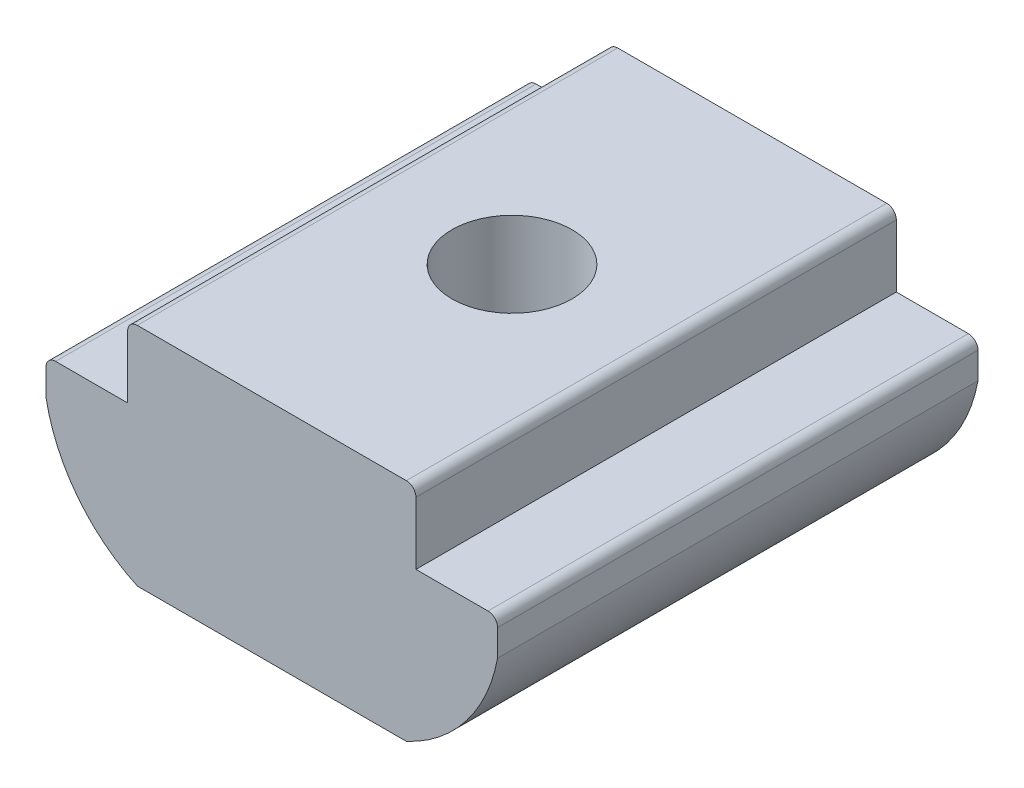
ISO-10303-21;
HEADER;
FILE_DESCRIPTION(('STEP AP214'),'2;1');
FILE_NAME('part.step','',(''),(''),'','','');
FILE_SCHEMA(('AUTOMOTIVE_DESIGN { 1 0 10303 214 1 1 1 1 }'));
ENDSEC;
DATA;
#1=APPLICATION_CONTEXT('core data for automotive mechanical design processes');
#2=APPLICATION_PROTOCOL_DEFINITION('international standard','automotive_design',2000,#1);
#3=PRODUCT_CONTEXT('',#1,'mechanical');
#4=PRODUCT('Part','Part','',(#3));
#5=PRODUCT_RELATED_PRODUCT_CATEGORY('part','',(#4));
#6=PRODUCT_DEFINITION_FORMATION('','',#4);
#7=PRODUCT_DEFINITION_CONTEXT('part definition',#1,'design');
#8=PRODUCT_DEFINITION('design','',#6,#7);
#9=PRODUCT_DEFINITION_SHAPE('','',#8);
#10=(LENGTH_UNIT() NAMED_UNIT(*) SI_UNIT(.MILLI.,.METRE.));
#11=(NAMED_UNIT(*) PLANE_ANGLE_UNIT() SI_UNIT($,.RADIAN.));
#12=(NAMED_UNIT(*) SI_UNIT($,.STERADIAN.) SOLID_ANGLE_UNIT());
#13=UNCERTAINTY_MEASURE_WITH_UNIT(LENGTH_MEASURE(1.E-05),#10,'distance_accuracy_value','');
#14=(GEOMETRIC_REPRESENTATION_CONTEXT(3) GLOBAL_UNCERTAINTY_ASSIGNED_CONTEXT((#13)) GLOBAL_UNIT_ASSIGNED_CONTEXT((#10,
#11,#12)) REPRESENTATION_CONTEXT('',''));
#15=CARTESIAN_POINT('',(0.,0.,0.));
#16=DIRECTION('',(0.,0.,1.));
#17=DIRECTION('',(1.,0.,0.));
#18=AXIS2_PLACEMENT_3D('',#15,#16,#17);
#19=CARTESIAN_POINT('',(-2.80000000000018,4.69999999999982,5.));
#20=DIRECTION('',(0.,-1.,0.));
#21=DIRECTION('',(0.,0.,-1.));
#22=AXIS2_PLACEMENT_3D('',#19,#20,#21);
#23=PLANE('',#22);
#24=DIRECTION('',(-1.,0.,0.));
#25=VECTOR('',#24,1.);
#26=CARTESIAN_POINT('',(-2.80000000000018,4.69999999999982,-5.));
#27=LINE('',#26,#25);
#28=CARTESIAN_POINT('',(2.80000000000018,4.69999999999982,-5.));
#29=VERTEX_POINT('',#28);
#30=CARTESIAN_POINT('',(-2.80000000000018,4.69999999999982,-5.));
#31=VERTEX_POINT('',#30);
#32=EDGE_CURVE('E112',#29,#31,#27,.T.);
#33=ORIENTED_EDGE('',*,*,#32,.T.);
#34=DIRECTION('',(0.,0.,-1.));
#35=VECTOR('',#34,1.);
#36=CARTESIAN_POINT('',(-2.80000000000018,4.69999999999982,5.));
#37=LINE('',#36,#35);
#38=CARTESIAN_POINT('',(-2.80000000000018,4.69999999999982,5.));
#39=VERTEX_POINT('',#38);
#40=EDGE_CURVE('E175',#39,#31,#37,.T.);
#41=ORIENTED_EDGE('',*,*,#40,.F.);
#42=DIRECTION('',(-1.,0.,0.));
#43=VECTOR('',#42,1.);
#44=CARTESIAN_POINT('',(-2.80000000000018,4.69999999999982,5.));
#45=LINE('',#44,#43);
#46=CARTESIAN_POINT('',(2.80000000000018,4.69999999999982,5.));
#47=VERTEX_POINT('',#46);
#48=EDGE_CURVE('E59',#47,#39,#45,.T.);
#49=ORIENTED_EDGE('',*,*,#48,.F.);
#50=DIRECTION('',(0.,0.,-1.));
#51=VECTOR('',#50,1.);
#52=CARTESIAN_POINT('',(2.80000000000018,4.69999999999982,5.));
#53=LINE('',#52,#51);
#54=EDGE_CURVE('E169',#47,#29,#53,.T.);
#55=ORIENTED_EDGE('',*,*,#54,.T.);
#56=EDGE_LOOP('',(#33,#41,#49,#55));
#57=FACE_BOUND('',#56,.T.);
#58=CARTESIAN_POINT('',(0.,4.69999999999982,0.));
#59=DIRECTION('',(0.,1.,0.));
#60=DIRECTION('',(0.,0.,1.));
#61=AXIS2_PLACEMENT_3D('',#58,#59,#60);
#62=CIRCLE('',#61,1.25);
#63=CARTESIAN_POINT('',(0.,4.69999999999982,1.25));
#64=VERTEX_POINT('',#63);
#65=EDGE_CURVE('E322',#64,#64,#62,.T.);
#66=ORIENTED_EDGE('',*,*,#65,.F.);
#67=EDGE_LOOP('',(#66));
#68=FACE_BOUND('',#67,.T.);
#69=ADVANCED_FACE('F41',(#57,#68),#23,.F.);
#70=CARTESIAN_POINT('',(-2.79999999999882,4.49999999999909,5.));
#71=DIRECTION('',(0.,0.,-1.));
#72=DIRECTION('',(-1.,0.,0.));
#73=AXIS2_PLACEMENT_3D('',#70,#71,#72);
#74=CYLINDRICAL_SURFACE('',#73,0.200000000000955);
#75=CARTESIAN_POINT('',(-2.79999999999882,4.49999999999909,-5.));
#76=DIRECTION('',(0.,0.,1.));
#77=DIRECTION('',(1.,0.,0.));
#78=AXIS2_PLACEMENT_3D('',#75,#76,#77);
#79=CIRCLE('',#78,0.200000000000955);
#80=CARTESIAN_POINT('',(-3.,4.5,-5.));
#81=VERTEX_POINT('',#80);
#82=EDGE_CURVE('E179',#31,#81,#79,.T.);
#83=ORIENTED_EDGE('',*,*,#82,.T.);
#84=DIRECTION('',(0.,0.,-1.));
#85=VECTOR('',#84,1.);
#86=CARTESIAN_POINT('',(-3.,4.5,5.));
#87=LINE('',#86,#85);
#88=CARTESIAN_POINT('',(-3.,4.5,5.));
#89=VERTEX_POINT('',#88);
#90=EDGE_CURVE('E11',#89,#81,#87,.T.);
#91=ORIENTED_EDGE('',*,*,#90,.F.);
#92=CARTESIAN_POINT('',(-2.79999999999882,4.49999999999909,5.));
#93=DIRECTION('',(0.,0.,1.));
#94=DIRECTION('',(1.,0.,0.));
#95=AXIS2_PLACEMENT_3D('',#92,#93,#94);
#96=CIRCLE('',#95,0.200000000000955);
#97=EDGE_CURVE('E220',#39,#89,#96,.T.);
#98=ORIENTED_EDGE('',*,*,#97,.F.);
#99=ORIENTED_EDGE('',*,*,#40,.T.);
#100=EDGE_LOOP('',(#83,#91,#98,#99));
#101=FACE_BOUND('',#100,.T.);
#102=ADVANCED_FACE('F43',(#101),#74,.T.);
#103=CARTESIAN_POINT('',(-3.,4.5,5.));
#104=DIRECTION('',(1.,-3.49947101211426E-13,0.));
#105=DIRECTION('',(3.49947101211426E-13,1.,0.));
#106=AXIS2_PLACEMENT_3D('',#103,#104,#105);
#107=PLANE('',#106);
#108=DIRECTION('',(-3.49947101211426E-13,-1.,0.));
#109=VECTOR('',#108,1.);
#110=CARTESIAN_POINT('',(-3.,4.5,-5.));
#111=LINE('',#110,#109);
#112=CARTESIAN_POINT('',(-3.00000000000046,3.19999999999982,-5.));
#113=VERTEX_POINT('',#112);
#114=EDGE_CURVE('E183',#81,#113,#111,.T.);
#115=ORIENTED_EDGE('',*,*,#114,.T.);
#116=DIRECTION('',(0.,0.,-1.));
#117=VECTOR('',#116,1.);
#118=CARTESIAN_POINT('',(-3.00000000000046,3.19999999999982,5.));
#119=LINE('',#118,#117);
#120=CARTESIAN_POINT('',(-3.00000000000046,3.19999999999982,5.));
#121=VERTEX_POINT('',#120);
#122=EDGE_CURVE('E51',#121,#113,#119,.T.);
#123=ORIENTED_EDGE('',*,*,#122,.F.);
#124=DIRECTION('',(-3.49947101211426E-13,-1.,0.));
#125=VECTOR('',#124,1.);
#126=CARTESIAN_POINT('',(-3.,4.5,5.));
#127=LINE('',#126,#125);
#128=EDGE_CURVE('E120',#89,#121,#127,.T.);
#129=ORIENTED_EDGE('',*,*,#128,.F.);
#130=ORIENTED_EDGE('',*,*,#90,.T.);
#131=EDGE_LOOP('',(#115,#123,#129,#130));
#132=FACE_BOUND('',#131,.T.);
#133=ADVANCED_FACE('F376',(#132),#107,.F.);
#134=CARTESIAN_POINT('',(-4.5,3.19999999999982,5.));
#135=DIRECTION('',(0.,-1.,0.));
#136=DIRECTION('',(0.,0.,-1.));
#137=AXIS2_PLACEMENT_3D('',#134,#135,#136);
#138=PLANE('',#137);
#139=DIRECTION('',(-1.,0.,0.));
#140=VECTOR('',#139,1.);
#141=CARTESIAN_POINT('',(-4.5,3.19999999999982,-5.));
#142=LINE('',#141,#140);
#143=CARTESIAN_POINT('',(-4.5,3.19999999999982,-5.));
#144=VERTEX_POINT('',#143);
#145=EDGE_CURVE('E187',#113,#144,#142,.T.);
#146=ORIENTED_EDGE('',*,*,#145,.T.);
#147=DIRECTION('',(0.,0.,-1.));
#148=VECTOR('',#147,1.);
#149=CARTESIAN_POINT('',(-4.5,3.19999999999982,5.));
#150=LINE('',#149,#148);
#151=CARTESIAN_POINT('',(-4.5,3.19999999999982,5.));
#152=VERTEX_POINT('',#151);
#153=EDGE_CURVE('E255',#152,#144,#150,.T.);
#154=ORIENTED_EDGE('',*,*,#153,.F.);
#155=DIRECTION('',(-1.,0.,0.));
#156=VECTOR('',#155,1.);
#157=CARTESIAN_POINT('',(-4.5,3.19999999999982,5.));
#158=LINE('',#157,#156);
#159=EDGE_CURVE('E265',#121,#152,#158,.T.);
#160=ORIENTED_EDGE('',*,*,#159,.F.);
#161=ORIENTED_EDGE('',*,*,#122,.T.);
#162=EDGE_LOOP('',(#146,#154,#160,#161));
#163=FACE_BOUND('',#162,.T.);
#164=ADVANCED_FACE('F263',(#163),#138,.F.);
#165=CARTESIAN_POINT('',(-4.49999999999909,2.99999999999909,5.));
#166=DIRECTION('',(0.,0.,-1.));
#167=DIRECTION('',(-1.,0.,0.));
#168=AXIS2_PLACEMENT_3D('',#165,#166,#167);
#169=CYLINDRICAL_SURFACE('',#168,0.200000000000727);
#170=CARTESIAN_POINT('',(-4.49999999999909,2.99999999999909,-5.));
#171=DIRECTION('',(0.,0.,1.));
#172=DIRECTION('',(1.,0.,0.));
#173=AXIS2_PLACEMENT_3D('',#170,#171,#172);
#174=CIRCLE('',#173,0.200000000000727);
#175=CARTESIAN_POINT('',(-4.69999999999982,3.,-5.));
#176=VERTEX_POINT('',#175);
#177=EDGE_CURVE('E190',#144,#176,#174,.T.);
#178=ORIENTED_EDGE('',*,*,#177,.T.);
#179=DIRECTION('',(0.,0.,-1.));
#180=VECTOR('',#179,1.);
#181=CARTESIAN_POINT('',(-4.69999999999982,3.,5.));
#182=LINE('',#181,#180);
#183=CARTESIAN_POINT('',(-4.69999999999982,3.,5.));
#184=VERTEX_POINT('',#183);
#185=EDGE_CURVE('E251',#184,#176,#182,.T.);
#186=ORIENTED_EDGE('',*,*,#185,.F.);
#187=CARTESIAN_POINT('',(-4.49999999999909,2.99999999999909,5.));
#188=DIRECTION('',(0.,0.,1.));
#189=DIRECTION('',(1.,0.,0.));
#190=AXIS2_PLACEMENT_3D('',#187,#188,#189);
#191=CIRCLE('',#190,0.200000000000727);
#192=EDGE_CURVE('E284',#152,#184,#191,.T.);
#193=ORIENTED_EDGE('',*,*,#192,.F.);
#194=ORIENTED_EDGE('',*,*,#153,.T.);
#195=EDGE_LOOP('',(#178,#186,#193,#194));
#196=FACE_BOUND('',#195,.T.);
#197=ADVANCED_FACE('F274',(#196),#169,.T.);
#198=CARTESIAN_POINT('',(-4.69999999999982,3.,5.));
#199=DIRECTION('',(1.,8.26359183097306E-13,0.));
#200=DIRECTION('',(-8.26359183097306E-13,1.,0.));
#201=AXIS2_PLACEMENT_3D('',#198,#199,#200);
#202=PLANE('',#201);
#203=DIRECTION('',(8.26359183097306E-13,-1.,0.));
#204=VECTOR('',#203,1.);
#205=CARTESIAN_POINT('',(-4.69999999999982,3.,-5.));
#206=LINE('',#205,#204);
#207=CARTESIAN_POINT('',(-4.69999999999938,2.44999999999709,-5.));
#208=VERTEX_POINT('',#207);
#209=EDGE_CURVE('E193',#176,#208,#206,.T.);
#210=ORIENTED_EDGE('',*,*,#209,.T.);
#211=DIRECTION('',(0.,0.,-1.));
#212=VECTOR('',#211,1.);
#213=CARTESIAN_POINT('',(-4.69999999999938,2.44999999999709,5.));
#214=LINE('',#213,#212);
#215=CARTESIAN_POINT('',(-4.69999999999938,2.44999999999709,5.));
#216=VERTEX_POINT('',#215);
#217=EDGE_CURVE('E247',#216,#208,#214,.T.);
#218=ORIENTED_EDGE('',*,*,#217,.F.);
#219=DIRECTION('',(8.26359183097306E-13,-1.,0.));
#220=VECTOR('',#219,1.);
#221=CARTESIAN_POINT('',(-4.69999999999982,3.,5.));
#222=LINE('',#221,#220);
#223=EDGE_CURVE('E280',#184,#216,#222,.T.);
#224=ORIENTED_EDGE('',*,*,#223,.F.);
#225=ORIENTED_EDGE('',*,*,#185,.T.);
#226=EDGE_LOOP('',(#210,#218,#224,#225));
#227=FACE_BOUND('',#226,.T.);
#228=ADVANCED_FACE('F278',(#227),#202,.F.);
#229=CARTESIAN_POINT('',(-1.37744345733017,3.06494180860091,5.));
#230=DIRECTION('',(0.,0.,-1.));
#231=DIRECTION('',(-1.,0.,0.));
#232=AXIS2_PLACEMENT_3D('',#229,#230,#231);
#233=CYLINDRICAL_SURFACE('',#232,3.37898437510488);
#234=CARTESIAN_POINT('',(-1.37744345733017,3.06494180860091,-5.));
#235=DIRECTION('',(0.,0.,1.));
#236=DIRECTION('',(1.,0.,0.));
#237=AXIS2_PLACEMENT_3D('',#234,#235,#236);
#238=CIRCLE('',#237,3.37898437510488);
#239=CARTESIAN_POINT('',(-2.80000000000018,0.,-5.));
#240=VERTEX_POINT('',#239);
#241=EDGE_CURVE('E196',#208,#240,#238,.T.);
#242=ORIENTED_EDGE('',*,*,#241,.T.);
#243=DIRECTION('',(0.,0.,-1.));
#244=VECTOR('',#243,1.);
#245=CARTESIAN_POINT('',(-2.80000000000018,0.,5.));
#246=LINE('',#245,#244);
#247=CARTESIAN_POINT('',(-2.80000000000018,0.,5.));
#248=VERTEX_POINT('',#247);
#249=EDGE_CURVE('E243',#248,#240,#246,.T.);
#250=ORIENTED_EDGE('',*,*,#249,.F.);
#251=CARTESIAN_POINT('',(-1.37744345733017,3.06494180860091,5.));
#252=DIRECTION('',(0.,0.,1.));
#253=DIRECTION('',(1.,0.,0.));
#254=AXIS2_PLACEMENT_3D('',#251,#252,#253);
#255=CIRCLE('',#254,3.37898437510488);
#256=EDGE_CURVE('E283',#216,#248,#255,.T.);
#257=ORIENTED_EDGE('',*,*,#256,.F.);
#258=ORIENTED_EDGE('',*,*,#217,.T.);
#259=EDGE_LOOP('',(#242,#250,#257,#258));
#260=FACE_BOUND('',#259,.T.);
#261=ADVANCED_FACE('F367',(#260),#233,.T.);
#262=CARTESIAN_POINT('',(-2.80000000000018,0.,5.));
#263=DIRECTION('',(0.,1.,0.));
#264=DIRECTION('',(0.,0.,1.));
#265=AXIS2_PLACEMENT_3D('',#262,#263,#264);
#266=PLANE('',#265);
#267=CARTESIAN_POINT('',(0.,0.,0.));
#268=DIRECTION('',(0.,1.,0.));
#269=DIRECTION('',(0.,0.,1.));
#270=AXIS2_PLACEMENT_3D('',#267,#268,#269);
#271=CIRCLE('',#270,1.25);
#272=CARTESIAN_POINT('',(0.,0.,1.25));
#273=VERTEX_POINT('',#272);
#274=EDGE_CURVE('E184',#273,#273,#271,.T.);
#275=ORIENTED_EDGE('',*,*,#274,.T.);
#276=EDGE_LOOP('',(#275));
#277=FACE_BOUND('',#276,.T.);
#278=DIRECTION('',(1.,0.,0.));
#279=VECTOR('',#278,1.);
#280=CARTESIAN_POINT('',(-2.80000000000018,0.,-5.));
#281=LINE('',#280,#279);
#282=CARTESIAN_POINT('',(2.79999999999976,0.,-5.));
#283=VERTEX_POINT('',#282);
#284=EDGE_CURVE('E199',#240,#283,#281,.T.);
#285=ORIENTED_EDGE('',*,*,#284,.T.);
#286=DIRECTION('',(0.,0.,-1.));
#287=VECTOR('',#286,1.);
#288=CARTESIAN_POINT('',(2.79999999999976,0.,5.));
#289=LINE('',#288,#287);
#290=CARTESIAN_POINT('',(2.79999999999976,0.,5.));
#291=VERTEX_POINT('',#290);
#292=EDGE_CURVE('E239',#291,#283,#289,.T.);
#293=ORIENTED_EDGE('',*,*,#292,.F.);
#294=DIRECTION('',(1.,0.,0.));
#295=VECTOR('',#294,1.);
#296=CARTESIAN_POINT('',(-2.80000000000018,0.,5.));
#297=LINE('',#296,#295);
#298=EDGE_CURVE('E288',#248,#291,#297,.T.);
#299=ORIENTED_EDGE('',*,*,#298,.F.);
#300=ORIENTED_EDGE('',*,*,#249,.T.);
#301=EDGE_LOOP('',(#285,#293,#299,#300));
#302=FACE_BOUND('',#301,.T.);
#303=ADVANCED_FACE('F336',(#277,#302),#266,.F.);
#304=CARTESIAN_POINT('',(1.37744345733017,3.06494180860091,5.));
#305=DIRECTION('',(0.,0.,-1.));
#306=DIRECTION('',(-1.,0.,0.));
#307=AXIS2_PLACEMENT_3D('',#304,#305,#306);
#308=CYLINDRICAL_SURFACE('',#307,3.37898437510478);
#309=CARTESIAN_POINT('',(1.37744345733017,3.06494180860091,-5.));
#310=DIRECTION('',(0.,0.,1.));
#311=DIRECTION('',(1.,0.,0.));
#312=AXIS2_PLACEMENT_3D('',#309,#310,#311);
#313=CIRCLE('',#312,3.37898437510478);
#314=CARTESIAN_POINT('',(4.69999999999936,2.44999999999709,-5.));
#315=VERTEX_POINT('',#314);
#316=EDGE_CURVE('E202',#283,#315,#313,.T.);
#317=ORIENTED_EDGE('',*,*,#316,.T.);
#318=DIRECTION('',(0.,0.,-1.));
#319=VECTOR('',#318,1.);
#320=CARTESIAN_POINT('',(4.69999999999936,2.44999999999709,5.));
#321=LINE('',#320,#319);
#322=CARTESIAN_POINT('',(4.69999999999936,2.44999999999709,5.));
#323=VERTEX_POINT('',#322);
#324=EDGE_CURVE('E235',#323,#315,#321,.T.);
#325=ORIENTED_EDGE('',*,*,#324,.F.);
#326=CARTESIAN_POINT('',(1.37744345733017,3.06494180860091,5.));
#327=DIRECTION('',(0.,0.,1.));
#328=DIRECTION('',(1.,0.,0.));
#329=AXIS2_PLACEMENT_3D('',#326,#327,#328);
#330=CIRCLE('',#329,3.37898437510478);
#331=EDGE_CURVE('E295',#291,#323,#330,.T.);
#332=ORIENTED_EDGE('',*,*,#331,.F.);
#333=ORIENTED_EDGE('',*,*,#292,.T.);
#334=EDGE_LOOP('',(#317,#325,#332,#333));
#335=FACE_BOUND('',#334,.T.);
#336=ADVANCED_FACE('F360',(#335),#308,.T.);
#337=CARTESIAN_POINT('',(4.69999999999982,3.,5.));
#338=DIRECTION('',(-1.,8.26359183097306E-13,0.));
#339=DIRECTION('',(-8.26359183097306E-13,-1.,0.));
#340=AXIS2_PLACEMENT_3D('',#337,#338,#339);
#341=PLANE('',#340);
#342=DIRECTION('',(8.26359183097306E-13,1.,0.));
#343=VECTOR('',#342,1.);
#344=CARTESIAN_POINT('',(4.69999999999982,3.,-5.));
#345=LINE('',#344,#343);
#346=CARTESIAN_POINT('',(4.69999999999982,3.,-5.));
#347=VERTEX_POINT('',#346);
#348=EDGE_CURVE('E205',#315,#347,#345,.T.);
#349=ORIENTED_EDGE('',*,*,#348,.T.);
#350=DIRECTION('',(0.,0.,-1.));
#351=VECTOR('',#350,1.);
#352=CARTESIAN_POINT('',(4.69999999999982,3.,5.));
#353=LINE('',#352,#351);
#354=CARTESIAN_POINT('',(4.69999999999982,3.,5.));
#355=VERTEX_POINT('',#354);
#356=EDGE_CURVE('E231',#355,#347,#353,.T.);
#357=ORIENTED_EDGE('',*,*,#356,.F.);
#358=DIRECTION('',(8.26359183097306E-13,1.,0.));
#359=VECTOR('',#358,1.);
#360=CARTESIAN_POINT('',(4.69999999999982,3.,5.));
#361=LINE('',#360,#359);
#362=EDGE_CURVE('E298',#323,#355,#361,.T.);
#363=ORIENTED_EDGE('',*,*,#362,.F.);
#364=ORIENTED_EDGE('',*,*,#324,.T.);
#365=EDGE_LOOP('',(#349,#357,#363,#364));
#366=FACE_BOUND('',#365,.T.);
#367=ADVANCED_FACE('F357',(#366),#341,.F.);
#368=CARTESIAN_POINT('',(4.49999999999864,2.99999999999864,5.));
#369=DIRECTION('',(0.,0.,-1.));
#370=DIRECTION('',(-1.,0.,0.));
#371=AXIS2_PLACEMENT_3D('',#368,#369,#370);
#372=CYLINDRICAL_SURFACE('',#371,0.200000000001182);
#373=CARTESIAN_POINT('',(4.49999999999864,2.99999999999864,-5.));
#374=DIRECTION('',(0.,0.,1.));
#375=DIRECTION('',(1.,0.,0.));
#376=AXIS2_PLACEMENT_3D('',#373,#374,#375);
#377=CIRCLE('',#376,0.200000000001182);
#378=CARTESIAN_POINT('',(4.5,3.19999999999982,-5.));
#379=VERTEX_POINT('',#378);
#380=EDGE_CURVE('E208',#347,#379,#377,.T.);
#381=ORIENTED_EDGE('',*,*,#380,.T.);
#382=DIRECTION('',(0.,0.,-1.));
#383=VECTOR('',#382,1.);
#384=CARTESIAN_POINT('',(4.5,3.19999999999982,5.));
#385=LINE('',#384,#383);
#386=CARTESIAN_POINT('',(4.5,3.19999999999982,5.));
#387=VERTEX_POINT('',#386);
#388=EDGE_CURVE('E227',#387,#379,#385,.T.);
#389=ORIENTED_EDGE('',*,*,#388,.F.);
#390=CARTESIAN_POINT('',(4.49999999999864,2.99999999999864,5.));
#391=DIRECTION('',(0.,0.,1.));
#392=DIRECTION('',(1.,0.,0.));
#393=AXIS2_PLACEMENT_3D('',#390,#391,#392);
#394=CIRCLE('',#393,0.200000000001182);
#395=EDGE_CURVE('E301',#355,#387,#394,.T.);
#396=ORIENTED_EDGE('',*,*,#395,.F.);
#397=ORIENTED_EDGE('',*,*,#356,.T.);
#398=EDGE_LOOP('',(#381,#389,#396,#397));
#399=FACE_BOUND('',#398,.T.);
#400=ADVANCED_FACE('F309',(#399),#372,.T.);
#401=CARTESIAN_POINT('',(3.,3.19999999999982,5.));
#402=DIRECTION('',(0.,-1.,0.));
#403=DIRECTION('',(0.,0.,-1.));
#404=AXIS2_PLACEMENT_3D('',#401,#402,#403);
#405=PLANE('',#404);
#406=DIRECTION('',(-1.,0.,0.));
#407=VECTOR('',#406,1.);
#408=CARTESIAN_POINT('',(3.,3.19999999999982,-5.));
#409=LINE('',#408,#407);
#410=CARTESIAN_POINT('',(3.,3.19999999999982,-5.));
#411=VERTEX_POINT('',#410);
#412=EDGE_CURVE('E211',#379,#411,#409,.T.);
#413=ORIENTED_EDGE('',*,*,#412,.T.);
#414=DIRECTION('',(0.,0.,-1.));
#415=VECTOR('',#414,1.);
#416=CARTESIAN_POINT('',(3.,3.19999999999982,5.));
#417=LINE('',#416,#415);
#418=CARTESIAN_POINT('',(3.,3.19999999999982,5.));
#419=VERTEX_POINT('',#418);
#420=EDGE_CURVE('E168',#419,#411,#417,.T.);
#421=ORIENTED_EDGE('',*,*,#420,.F.);
#422=DIRECTION('',(-1.,0.,0.));
#423=VECTOR('',#422,1.);
#424=CARTESIAN_POINT('',(3.,3.19999999999982,5.));
#425=LINE('',#424,#423);
#426=EDGE_CURVE('E157',#387,#419,#425,.T.);
#427=ORIENTED_EDGE('',*,*,#426,.F.);
#428=ORIENTED_EDGE('',*,*,#388,.T.);
#429=EDGE_LOOP('',(#413,#421,#427,#428));
#430=FACE_BOUND('',#429,.T.);
#431=ADVANCED_FACE('F313',(#430),#405,.F.);
#432=CARTESIAN_POINT('',(3.,4.5,5.));
#433=DIRECTION('',(-1.,0.,0.));
#434=DIRECTION('',(0.,0.,1.));
#435=AXIS2_PLACEMENT_3D('',#432,#433,#434);
#436=PLANE('',#435);
#437=DIRECTION('',(0.,1.,0.));
#438=VECTOR('',#437,1.);
#439=CARTESIAN_POINT('',(3.,4.5,-5.));
#440=LINE('',#439,#438);
#441=CARTESIAN_POINT('',(3.,4.5,-5.));
#442=VERTEX_POINT('',#441);
#443=EDGE_CURVE('E166',#411,#442,#440,.T.);
#444=ORIENTED_EDGE('',*,*,#443,.T.);
#445=DIRECTION('',(0.,0.,-1.));
#446=VECTOR('',#445,1.);
#447=CARTESIAN_POINT('',(3.,4.5,5.));
#448=LINE('',#447,#446);
#449=CARTESIAN_POINT('',(3.,4.5,5.));
#450=VERTEX_POINT('',#449);
#451=EDGE_CURVE('E163',#450,#442,#448,.T.);
#452=ORIENTED_EDGE('',*,*,#451,.F.);
#453=DIRECTION('',(0.,1.,0.));
#454=VECTOR('',#453,1.);
#455=CARTESIAN_POINT('',(3.,4.5,5.));
#456=LINE('',#455,#454);
#457=EDGE_CURVE('E151',#419,#450,#456,.T.);
#458=ORIENTED_EDGE('',*,*,#457,.F.);
#459=ORIENTED_EDGE('',*,*,#420,.T.);
#460=EDGE_LOOP('',(#444,#452,#458,#459));
#461=FACE_BOUND('',#460,.T.);
#462=ADVANCED_FACE('F164',(#461),#436,.F.);
#463=CARTESIAN_POINT('',(2.79999999999927,4.49999999999909,5.));
#464=DIRECTION('',(0.,0.,-1.));
#465=DIRECTION('',(-1.,0.,0.));
#466=AXIS2_PLACEMENT_3D('',#463,#464,#465);
#467=CYLINDRICAL_SURFACE('',#466,0.200000000000728);
#468=CARTESIAN_POINT('',(2.79999999999927,4.49999999999909,-5.));
#469=DIRECTION('',(0.,0.,1.));
#470=DIRECTION('',(1.,0.,0.));
#471=AXIS2_PLACEMENT_3D('',#468,#469,#470);
#472=CIRCLE('',#471,0.200000000000728);
#473=EDGE_CURVE('E106',#442,#29,#472,.T.);
#474=ORIENTED_EDGE('',*,*,#473,.T.);
#475=ORIENTED_EDGE('',*,*,#54,.F.);
#476=CARTESIAN_POINT('',(2.79999999999927,4.49999999999909,5.));
#477=DIRECTION('',(0.,0.,1.));
#478=DIRECTION('',(1.,0.,0.));
#479=AXIS2_PLACEMENT_3D('',#476,#477,#478);
#480=CIRCLE('',#479,0.200000000000728);
#481=EDGE_CURVE('E155',#450,#47,#480,.T.);
#482=ORIENTED_EDGE('',*,*,#481,.F.);
#483=ORIENTED_EDGE('',*,*,#451,.T.);
#484=EDGE_LOOP('',(#474,#475,#482,#483));
#485=FACE_BOUND('',#484,.T.);
#486=ADVANCED_FACE('F171',(#485),#467,.T.);
#487=CARTESIAN_POINT('',(-2.79999999999882,4.49999999999909,5.));
#488=DIRECTION('',(0.,0.,1.));
#489=DIRECTION('',(1.,0.,0.));
#490=AXIS2_PLACEMENT_3D('',#487,#488,#489);
#491=PLANE('',#490);
#492=ORIENTED_EDGE('',*,*,#97,.T.);
#493=ORIENTED_EDGE('',*,*,#128,.T.);
#494=ORIENTED_EDGE('',*,*,#159,.T.);
#495=ORIENTED_EDGE('',*,*,#192,.T.);
#496=ORIENTED_EDGE('',*,*,#223,.T.);
#497=ORIENTED_EDGE('',*,*,#256,.T.);
#498=ORIENTED_EDGE('',*,*,#298,.T.);
#499=ORIENTED_EDGE('',*,*,#331,.T.);
#500=ORIENTED_EDGE('',*,*,#362,.T.);
#501=ORIENTED_EDGE('',*,*,#395,.T.);
#502=ORIENTED_EDGE('',*,*,#426,.T.);
#503=ORIENTED_EDGE('',*,*,#457,.T.);
#504=ORIENTED_EDGE('',*,*,#481,.T.);
#505=ORIENTED_EDGE('',*,*,#48,.T.);
#506=EDGE_LOOP('',(#492,#493,#494,#495,#496,#497,#498,#499,#500,#501,#502,#503,#504,#505));
#507=FACE_BOUND('',#506,.T.);
#508=ADVANCED_FACE('F153',(#507),#491,.T.);
#509=CARTESIAN_POINT('',(-2.79999999999882,4.49999999999909,-5.));
#510=DIRECTION('',(0.,0.,1.));
#511=DIRECTION('',(1.,0.,0.));
#512=AXIS2_PLACEMENT_3D('',#509,#510,#511);
#513=PLANE('',#512);
#514=ORIENTED_EDGE('',*,*,#82,.F.);
#515=ORIENTED_EDGE('',*,*,#32,.F.);
#516=ORIENTED_EDGE('',*,*,#473,.F.);
#517=ORIENTED_EDGE('',*,*,#443,.F.);
#518=ORIENTED_EDGE('',*,*,#412,.F.);
#519=ORIENTED_EDGE('',*,*,#380,.F.);
#520=ORIENTED_EDGE('',*,*,#348,.F.);
#521=ORIENTED_EDGE('',*,*,#316,.F.);
#522=ORIENTED_EDGE('',*,*,#284,.F.);
#523=ORIENTED_EDGE('',*,*,#241,.F.);
#524=ORIENTED_EDGE('',*,*,#209,.F.);
#525=ORIENTED_EDGE('',*,*,#177,.F.);
#526=ORIENTED_EDGE('',*,*,#145,.F.);
#527=ORIENTED_EDGE('',*,*,#114,.F.);
#528=EDGE_LOOP('',(#514,#515,#516,#517,#518,#519,#520,#521,#522,#523,#524,#525,#526,#527));
#529=FACE_BOUND('',#528,.T.);
#530=ADVANCED_FACE('F269',(#529),#513,.F.);
#531=CARTESIAN_POINT('',(0.,4.69999999999982,0.));
#532=DIRECTION('',(0.,1.,0.));
#533=DIRECTION('',(0.,0.,1.));
#534=AXIS2_PLACEMENT_3D('',#531,#532,#533);
#535=CYLINDRICAL_SURFACE('',#534,1.25);
#536=ORIENTED_EDGE('',*,*,#65,.T.);
#537=EDGE_LOOP('',(#536));
#538=FACE_BOUND('',#537,.T.);
#539=ORIENTED_EDGE('',*,*,#274,.F.);
#540=EDGE_LOOP('',(#539));
#541=FACE_BOUND('',#540,.T.);
#542=ADVANCED_FACE('F339',(#538,#541),#535,.F.);
#543=CLOSED_SHELL('',(#69,#102,#133,#164,#197,#228,#261,#303,#336,#367,#400,#431,#462,#486,#508,
#530,#542));
#544=MANIFOLD_SOLID_BREP('B2',#543);
#545=ADVANCED_BREP_SHAPE_REPRESENTATION('',(#18,#544),#14);
#546=SHAPE_DEFINITION_REPRESENTATION(#9,#545);
ENDSEC;
END-ISO-10303-21;
